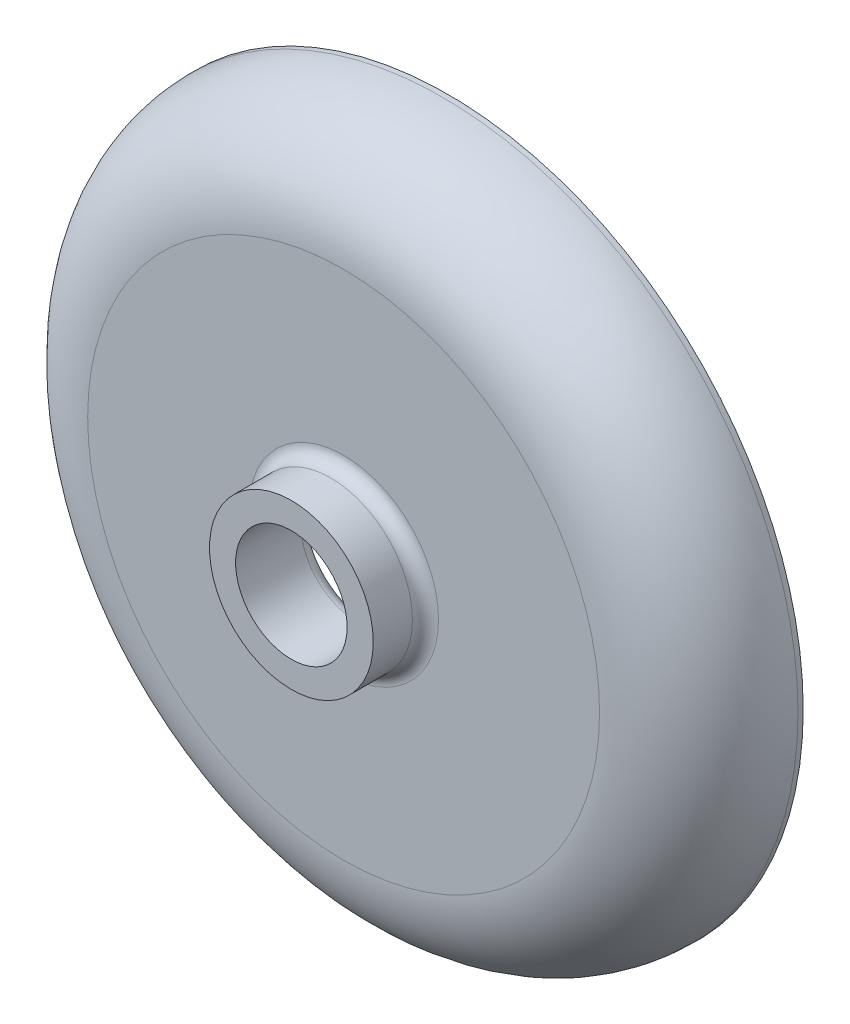
ISO-10303-21;
HEADER;
FILE_DESCRIPTION(('STEP AP214'),'2;1');
FILE_NAME('part.step','',(''),(''),'','','');
FILE_SCHEMA(('AUTOMOTIVE_DESIGN { 1 0 10303 214 1 1 1 1 }'));
ENDSEC;
DATA;
#1=APPLICATION_CONTEXT('core data for automotive mechanical design processes');
#2=APPLICATION_PROTOCOL_DEFINITION('international standard','automotive_design',2000,#1);
#3=PRODUCT_CONTEXT('',#1,'mechanical');
#4=PRODUCT('Part','Part','',(#3));
#5=PRODUCT_RELATED_PRODUCT_CATEGORY('part','',(#4));
#6=PRODUCT_DEFINITION_FORMATION('','',#4);
#7=PRODUCT_DEFINITION_CONTEXT('part definition',#1,'design');
#8=PRODUCT_DEFINITION('design','',#6,#7);
#9=PRODUCT_DEFINITION_SHAPE('','',#8);
#10=(LENGTH_UNIT() NAMED_UNIT(*) SI_UNIT(.MILLI.,.METRE.));
#11=(NAMED_UNIT(*) PLANE_ANGLE_UNIT() SI_UNIT($,.RADIAN.));
#12=(NAMED_UNIT(*) SI_UNIT($,.STERADIAN.) SOLID_ANGLE_UNIT());
#13=UNCERTAINTY_MEASURE_WITH_UNIT(LENGTH_MEASURE(1.E-05),#10,'distance_accuracy_value','');
#14=(GEOMETRIC_REPRESENTATION_CONTEXT(3) GLOBAL_UNCERTAINTY_ASSIGNED_CONTEXT((#13)) GLOBAL_UNIT_ASSIGNED_CONTEXT((#10,
#11,#12)) REPRESENTATION_CONTEXT('',''));
#15=CARTESIAN_POINT('',(0.,0.,0.));
#16=DIRECTION('',(0.,0.,1.));
#17=DIRECTION('',(1.,0.,0.));
#18=AXIS2_PLACEMENT_3D('',#15,#16,#17);
#19=CARTESIAN_POINT('',(0.,0.,4.));
#20=DIRECTION('',(0.,0.,-1.));
#21=DIRECTION('',(-1.,0.,0.));
#22=AXIS2_PLACEMENT_3D('',#19,#20,#21);
#23=CYLINDRICAL_SURFACE('',#22,13.6);
#24=CARTESIAN_POINT('',(0.,0.,0.2));
#25=DIRECTION('',(0.,0.,1.));
#26=DIRECTION('',(1.,0.,0.));
#27=AXIS2_PLACEMENT_3D('',#24,#25,#26);
#28=CIRCLE('',#27,13.6);
#29=CARTESIAN_POINT('',(13.6,0.,0.2));
#30=VERTEX_POINT('',#29);
#31=EDGE_CURVE('E52',#30,#30,#28,.F.);
#32=ORIENTED_EDGE('',*,*,#31,.T.);
#33=EDGE_LOOP('',(#32));
#34=FACE_BOUND('',#33,.T.);
#35=CARTESIAN_POINT('',(0.,0.,0.));
#36=DIRECTION('',(0.,0.,1.));
#37=DIRECTION('',(1.,0.,0.));
#38=AXIS2_PLACEMENT_3D('',#35,#36,#37);
#39=CIRCLE('',#38,13.6);
#40=CARTESIAN_POINT('',(13.6,0.,0.));
#41=VERTEX_POINT('',#40);
#42=EDGE_CURVE('E58',#41,#41,#39,.T.);
#43=ORIENTED_EDGE('',*,*,#42,.T.);
#44=EDGE_LOOP('',(#43));
#45=FACE_BOUND('',#44,.T.);
#46=ADVANCED_FACE('F32',(#34,#45),#23,.T.);
#47=CARTESIAN_POINT('',(0.,0.,4.));
#48=DIRECTION('',(0.,0.,1.));
#49=DIRECTION('',(1.,0.,0.));
#50=AXIS2_PLACEMENT_3D('',#47,#48,#49);
#51=PLANE('',#50);
#52=CARTESIAN_POINT('',(0.,0.,4.));
#53=DIRECTION('',(0.,0.,1.));
#54=DIRECTION('',(1.,0.,0.));
#55=AXIS2_PLACEMENT_3D('',#52,#53,#54);
#56=CIRCLE('',#55,3.635);
#57=CARTESIAN_POINT('',(3.635,0.,4.));
#58=VERTEX_POINT('',#57);
#59=EDGE_CURVE('E43',#58,#58,#56,.F.);
#60=ORIENTED_EDGE('',*,*,#59,.T.);
#61=EDGE_LOOP('',(#60));
#62=FACE_BOUND('',#61,.T.);
#63=CARTESIAN_POINT('',(0.,0.,4.));
#64=DIRECTION('',(0.,0.,1.));
#65=DIRECTION('',(1.,0.,0.));
#66=AXIS2_PLACEMENT_3D('',#63,#64,#65);
#67=CIRCLE('',#66,9.8);
#68=CARTESIAN_POINT('',(9.8,0.,4.));
#69=VERTEX_POINT('',#68);
#70=EDGE_CURVE('E55',#69,#69,#67,.T.);
#71=ORIENTED_EDGE('',*,*,#70,.T.);
#72=EDGE_LOOP('',(#71));
#73=FACE_BOUND('',#72,.T.);
#74=ADVANCED_FACE('F99',(#62,#73),#51,.T.);
#75=CARTESIAN_POINT('',(0.,0.,0.));
#76=DIRECTION('',(0.,0.,1.));
#77=DIRECTION('',(1.,0.,0.));
#78=AXIS2_PLACEMENT_3D('',#75,#76,#77);
#79=PLANE('',#78);
#80=CARTESIAN_POINT('',(0.,0.,0.));
#81=DIRECTION('',(0.,0.,1.));
#82=DIRECTION('',(1.,0.,0.));
#83=AXIS2_PLACEMENT_3D('',#80,#81,#82);
#84=CIRCLE('',#83,12.6);
#85=CARTESIAN_POINT('',(12.6,0.,0.));
#86=VERTEX_POINT('',#85);
#87=EDGE_CURVE('E65',#86,#86,#84,.T.);
#88=ORIENTED_EDGE('',*,*,#87,.T.);
#89=EDGE_LOOP('',(#88));
#90=FACE_BOUND('',#89,.T.);
#91=ORIENTED_EDGE('',*,*,#42,.F.);
#92=EDGE_LOOP('',(#91));
#93=FACE_BOUND('',#92,.T.);
#94=ADVANCED_FACE('F94',(#90,#93),#79,.F.);
#95=CARTESIAN_POINT('',(0.,0.,0.2));
#96=DIRECTION('',(0.,0.,1.));
#97=DIRECTION('',(1.,0.,0.));
#98=AXIS2_PLACEMENT_3D('',#95,#96,#97);
#99=TOROIDAL_SURFACE('',#98,9.8,3.8);
#100=ORIENTED_EDGE('',*,*,#31,.F.);
#101=EDGE_LOOP('',(#100));
#102=FACE_BOUND('',#101,.T.);
#103=ORIENTED_EDGE('',*,*,#70,.F.);
#104=EDGE_LOOP('',(#103));
#105=FACE_BOUND('',#104,.T.);
#106=ADVANCED_FACE('F88',(#102,#105),#99,.T.);
#107=CARTESIAN_POINT('',(0.,0.,6.));
#108=DIRECTION('',(0.,0.,-1.));
#109=DIRECTION('',(-1.,0.,0.));
#110=AXIS2_PLACEMENT_3D('',#107,#108,#109);
#111=CYLINDRICAL_SURFACE('',#110,3.135);
#112=CARTESIAN_POINT('',(0.,0.,4.5));
#113=DIRECTION('',(0.,0.,1.));
#114=DIRECTION('',(1.,0.,0.));
#115=AXIS2_PLACEMENT_3D('',#112,#113,#114);
#116=CIRCLE('',#115,3.135);
#117=CARTESIAN_POINT('',(3.135,0.,4.5));
#118=VERTEX_POINT('',#117);
#119=EDGE_CURVE('E47',#118,#118,#116,.T.);
#120=ORIENTED_EDGE('',*,*,#119,.T.);
#121=EDGE_LOOP('',(#120));
#122=FACE_BOUND('',#121,.T.);
#123=CARTESIAN_POINT('',(0.,0.,6.));
#124=DIRECTION('',(0.,0.,1.));
#125=DIRECTION('',(1.,0.,0.));
#126=AXIS2_PLACEMENT_3D('',#123,#124,#125);
#127=CIRCLE('',#126,3.135);
#128=CARTESIAN_POINT('',(3.135,0.,6.));
#129=VERTEX_POINT('',#128);
#130=EDGE_CURVE('E61',#129,#129,#127,.T.);
#131=ORIENTED_EDGE('',*,*,#130,.F.);
#132=EDGE_LOOP('',(#131));
#133=FACE_BOUND('',#132,.T.);
#134=ADVANCED_FACE('F83',(#122,#133),#111,.T.);
#135=CARTESIAN_POINT('',(0.,0.,6.));
#136=DIRECTION('',(0.,0.,1.));
#137=DIRECTION('',(1.,0.,0.));
#138=AXIS2_PLACEMENT_3D('',#135,#136,#137);
#139=PLANE('',#138);
#140=CARTESIAN_POINT('',(0.,0.,6.));
#141=DIRECTION('',(0.,0.,1.));
#142=DIRECTION('',(1.,0.,0.));
#143=AXIS2_PLACEMENT_3D('',#140,#141,#142);
#144=CIRCLE('',#143,2.135);
#145=CARTESIAN_POINT('',(2.135,0.,6.));
#146=VERTEX_POINT('',#145);
#147=EDGE_CURVE('E69',#146,#146,#144,.T.);
#148=ORIENTED_EDGE('',*,*,#147,.F.);
#149=EDGE_LOOP('',(#148));
#150=FACE_BOUND('',#149,.T.);
#151=ORIENTED_EDGE('',*,*,#130,.T.);
#152=EDGE_LOOP('',(#151));
#153=FACE_BOUND('',#152,.T.);
#154=ADVANCED_FACE('F79',(#150,#153),#139,.T.);
#155=CARTESIAN_POINT('',(0.,0.,4.));
#156=DIRECTION('',(0.,0.,-1.));
#157=DIRECTION('',(-1.,0.,0.));
#158=AXIS2_PLACEMENT_3D('',#155,#156,#157);
#159=CYLINDRICAL_SURFACE('',#158,12.6);
#160=CARTESIAN_POINT('',(0.,0.,0.2));
#161=DIRECTION('',(0.,0.,-1.));
#162=DIRECTION('',(-1.,0.,0.));
#163=AXIS2_PLACEMENT_3D('',#160,#161,#162);
#164=CIRCLE('',#163,12.6);
#165=CARTESIAN_POINT('',(-12.6,0.,0.2));
#166=VERTEX_POINT('',#165);
#167=EDGE_CURVE('E64',#166,#166,#164,.T.);
#168=ORIENTED_EDGE('',*,*,#167,.F.);
#169=EDGE_LOOP('',(#168));
#170=FACE_BOUND('',#169,.T.);
#171=ORIENTED_EDGE('',*,*,#87,.F.);
#172=EDGE_LOOP('',(#171));
#173=FACE_BOUND('',#172,.T.);
#174=ADVANCED_FACE('F82',(#170,#173),#159,.F.);
#175=CARTESIAN_POINT('',(0.,0.,3.));
#176=DIRECTION('',(0.,0.,1.));
#177=DIRECTION('',(1.,0.,0.));
#178=AXIS2_PLACEMENT_3D('',#175,#176,#177);
#179=PLANE('',#178);
#180=CARTESIAN_POINT('',(0.,0.,3.));
#181=DIRECTION('',(0.,0.,1.));
#182=DIRECTION('',(1.,0.,0.));
#183=AXIS2_PLACEMENT_3D('',#180,#181,#182);
#184=CIRCLE('',#183,2.635);
#185=CARTESIAN_POINT('',(2.635,0.,3.));
#186=VERTEX_POINT('',#185);
#187=EDGE_CURVE('E39',#186,#186,#184,.T.);
#188=ORIENTED_EDGE('',*,*,#187,.T.);
#189=EDGE_LOOP('',(#188));
#190=FACE_BOUND('',#189,.T.);
#191=CARTESIAN_POINT('',(0.,0.,3.));
#192=DIRECTION('',(0.,0.,1.));
#193=DIRECTION('',(1.,0.,0.));
#194=AXIS2_PLACEMENT_3D('',#191,#192,#193);
#195=CIRCLE('',#194,9.8);
#196=CARTESIAN_POINT('',(9.8,0.,3.));
#197=VERTEX_POINT('',#196);
#198=EDGE_CURVE('E68',#197,#197,#195,.T.);
#199=ORIENTED_EDGE('',*,*,#198,.F.);
#200=EDGE_LOOP('',(#199));
#201=FACE_BOUND('',#200,.T.);
#202=ADVANCED_FACE('F127',(#190,#201),#179,.F.);
#203=CARTESIAN_POINT('',(0.,0.,0.2));
#204=DIRECTION('',(0.,0.,1.));
#205=DIRECTION('',(1.,0.,0.));
#206=AXIS2_PLACEMENT_3D('',#203,#204,#205);
#207=TOROIDAL_SURFACE('',#206,9.8,2.8);
#208=ORIENTED_EDGE('',*,*,#167,.T.);
#209=EDGE_LOOP('',(#208));
#210=FACE_BOUND('',#209,.T.);
#211=ORIENTED_EDGE('',*,*,#198,.T.);
#212=EDGE_LOOP('',(#211));
#213=FACE_BOUND('',#212,.T.);
#214=ADVANCED_FACE('F116',(#210,#213),#207,.F.);
#215=CARTESIAN_POINT('',(0.,0.,6.));
#216=DIRECTION('',(0.,0.,-1.));
#217=DIRECTION('',(-1.,0.,0.));
#218=AXIS2_PLACEMENT_3D('',#215,#216,#217);
#219=CYLINDRICAL_SURFACE('',#218,2.135);
#220=CARTESIAN_POINT('',(0.,0.,3.5));
#221=DIRECTION('',(0.,0.,1.));
#222=DIRECTION('',(1.,0.,0.));
#223=AXIS2_PLACEMENT_3D('',#220,#221,#222);
#224=CIRCLE('',#223,2.135);
#225=CARTESIAN_POINT('',(2.135,0.,3.5));
#226=VERTEX_POINT('',#225);
#227=EDGE_CURVE('E10',#226,#226,#224,.F.);
#228=ORIENTED_EDGE('',*,*,#227,.T.);
#229=EDGE_LOOP('',(#228));
#230=FACE_BOUND('',#229,.T.);
#231=ORIENTED_EDGE('',*,*,#147,.T.);
#232=EDGE_LOOP('',(#231));
#233=FACE_BOUND('',#232,.T.);
#234=ADVANCED_FACE('F77',(#230,#233),#219,.F.);
#235=CARTESIAN_POINT('',(0.,0.,4.5));
#236=DIRECTION('',(0.,0.,1.));
#237=DIRECTION('',(1.,0.,0.));
#238=AXIS2_PLACEMENT_3D('',#235,#236,#237);
#239=TOROIDAL_SURFACE('',#238,3.635,0.5);
#240=ORIENTED_EDGE('',*,*,#59,.F.);
#241=EDGE_LOOP('',(#240));
#242=FACE_BOUND('',#241,.T.);
#243=ORIENTED_EDGE('',*,*,#119,.F.);
#244=EDGE_LOOP('',(#243));
#245=FACE_BOUND('',#244,.T.);
#246=ADVANCED_FACE('F108',(#242,#245),#239,.F.);
#247=CARTESIAN_POINT('',(0.,0.,3.5));
#248=DIRECTION('',(0.,0.,1.));
#249=DIRECTION('',(1.,0.,0.));
#250=AXIS2_PLACEMENT_3D('',#247,#248,#249);
#251=TOROIDAL_SURFACE('',#250,2.635,0.5);
#252=ORIENTED_EDGE('',*,*,#227,.F.);
#253=EDGE_LOOP('',(#252));
#254=FACE_BOUND('',#253,.T.);
#255=ORIENTED_EDGE('',*,*,#187,.F.);
#256=EDGE_LOOP('',(#255));
#257=FACE_BOUND('',#256,.T.);
#258=ADVANCED_FACE('F34',(#254,#257),#251,.T.);
#259=CLOSED_SHELL('',(#46,#74,#94,#106,#134,#154,#174,#202,#214,#234,#246,#258));
#260=MANIFOLD_SOLID_BREP('B2',#259);
#261=ADVANCED_BREP_SHAPE_REPRESENTATION('',(#18,#260),#14);
#262=SHAPE_DEFINITION_REPRESENTATION(#9,#261);
ENDSEC;
END-ISO-10303-21;
